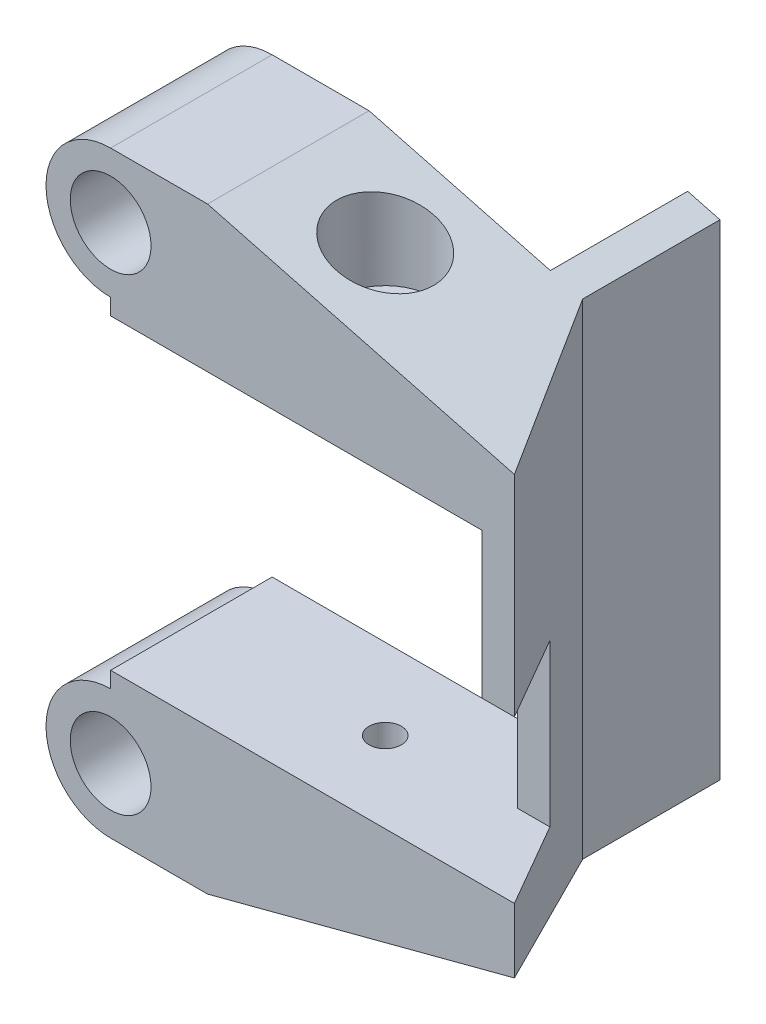
ISO-10303-21;
HEADER;
FILE_DESCRIPTION(('STEP AP214'),'2;1');
FILE_NAME('part.step','',(''),(''),'','','');
FILE_SCHEMA(('AUTOMOTIVE_DESIGN { 1 0 10303 214 1 1 1 1 }'));
ENDSEC;
DATA;
#1=APPLICATION_CONTEXT('core data for automotive mechanical design processes');
#2=APPLICATION_PROTOCOL_DEFINITION('international standard','automotive_design',2000,#1);
#3=PRODUCT_CONTEXT('',#1,'mechanical');
#4=PRODUCT('Part','Part','',(#3));
#5=PRODUCT_RELATED_PRODUCT_CATEGORY('part','',(#4));
#6=PRODUCT_DEFINITION_FORMATION('','',#4);
#7=PRODUCT_DEFINITION_CONTEXT('part definition',#1,'design');
#8=PRODUCT_DEFINITION('design','',#6,#7);
#9=PRODUCT_DEFINITION_SHAPE('','',#8);
#10=(LENGTH_UNIT() NAMED_UNIT(*) SI_UNIT(.MILLI.,.METRE.));
#11=(NAMED_UNIT(*) PLANE_ANGLE_UNIT() SI_UNIT($,.RADIAN.));
#12=(NAMED_UNIT(*) SI_UNIT($,.STERADIAN.) SOLID_ANGLE_UNIT());
#13=UNCERTAINTY_MEASURE_WITH_UNIT(LENGTH_MEASURE(1.E-05),#10,'distance_accuracy_value','');
#14=(GEOMETRIC_REPRESENTATION_CONTEXT(3) GLOBAL_UNCERTAINTY_ASSIGNED_CONTEXT((#13)) GLOBAL_UNIT_ASSIGNED_CONTEXT((#10,
#11,#12)) REPRESENTATION_CONTEXT('',''));
#15=CARTESIAN_POINT('',(0.,0.,0.));
#16=DIRECTION('',(0.,0.,1.));
#17=DIRECTION('',(1.,0.,0.));
#18=AXIS2_PLACEMENT_3D('',#15,#16,#17);
#19=CARTESIAN_POINT('',(-131.23163521819,17.7006515426684,10.));
#20=DIRECTION('',(0.,0.,1.));
#21=DIRECTION('',(1.,0.,0.));
#22=AXIS2_PLACEMENT_3D('',#19,#20,#21);
#23=PLANE('',#22);
#24=DIRECTION('',(-1.,0.,0.));
#25=VECTOR('',#24,1.);
#26=CARTESIAN_POINT('',(-108.23163521819,32.7006515426684,10.));
#27=LINE('',#26,#25);
#28=CARTESIAN_POINT('',(-106.23163521819,32.7006515426684,10.));
#29=VERTEX_POINT('',#28);
#30=CARTESIAN_POINT('',(-108.23163521819,32.7006515426684,10.));
#31=VERTEX_POINT('',#30);
#32=EDGE_CURVE('E181',#29,#31,#27,.T.);
#33=ORIENTED_EDGE('',*,*,#32,.F.);
#34=DIRECTION('',(0.,1.,0.));
#35=VECTOR('',#34,1.);
#36=CARTESIAN_POINT('',(-106.23163521819,22.7006515426684,10.));
#37=LINE('',#36,#35);
#38=CARTESIAN_POINT('',(-106.23163521819,45.7006515426684,10.));
#39=VERTEX_POINT('',#38);
#40=EDGE_CURVE('E219',#29,#39,#37,.T.);
#41=ORIENTED_EDGE('',*,*,#40,.T.);
#42=DIRECTION('',(-0.967074537262646,0.254493299279644,0.));
#43=VECTOR('',#42,1.);
#44=CARTESIAN_POINT('',(-125.23163521819,50.7006515426684,10.));
#45=LINE('',#44,#43);
#46=CARTESIAN_POINT('',(-125.23163521819,50.7006515426684,10.));
#47=VERTEX_POINT('',#46);
#48=EDGE_CURVE('E336',#39,#47,#45,.T.);
#49=ORIENTED_EDGE('',*,*,#48,.T.);
#50=DIRECTION('',(1.,0.,0.));
#51=VECTOR('',#50,1.);
#52=CARTESIAN_POINT('',(-125.23163521819,50.7006515426684,10.));
#53=LINE('',#52,#51);
#54=CARTESIAN_POINT('',(-131.23163521819,50.7006515426684,10.));
#55=VERTEX_POINT('',#54);
#56=EDGE_CURVE('E298',#55,#47,#53,.T.);
#57=ORIENTED_EDGE('',*,*,#56,.F.);
#58=CARTESIAN_POINT('',(-131.23163521819,46.7006515426684,10.));
#59=DIRECTION('',(0.,0.,-1.));
#60=DIRECTION('',(1.,0.,0.));
#61=AXIS2_PLACEMENT_3D('',#58,#59,#60);
#62=CIRCLE('',#61,4.);
#63=CARTESIAN_POINT('',(-131.23163521819,42.7006515426684,10.));
#64=VERTEX_POINT('',#63);
#65=EDGE_CURVE('E315',#64,#55,#62,.T.);
#66=ORIENTED_EDGE('',*,*,#65,.F.);
#67=DIRECTION('',(0.,1.,0.));
#68=VECTOR('',#67,1.);
#69=CARTESIAN_POINT('',(-131.23163521819,41.7006515426684,10.));
#70=LINE('',#69,#68);
#71=CARTESIAN_POINT('',(-131.23163521819,41.7006515426684,10.));
#72=VERTEX_POINT('',#71);
#73=EDGE_CURVE('E318',#72,#64,#70,.T.);
#74=ORIENTED_EDGE('',*,*,#73,.F.);
#75=DIRECTION('',(-1.,0.,0.));
#76=VECTOR('',#75,1.);
#77=CARTESIAN_POINT('',(-106.23163521819,41.7006515426684,10.));
#78=LINE('',#77,#76);
#79=CARTESIAN_POINT('',(-108.23163521819,41.7006515426684,10.));
#80=VERTEX_POINT('',#79);
#81=EDGE_CURVE('E302',#80,#72,#78,.T.);
#82=ORIENTED_EDGE('',*,*,#81,.F.);
#83=DIRECTION('',(0.,-1.,0.));
#84=VECTOR('',#83,1.);
#85=CARTESIAN_POINT('',(-108.23163521819,32.2006515426684,10.));
#86=LINE('',#85,#84);
#87=EDGE_CURVE('E194',#80,#31,#86,.T.);
#88=ORIENTED_EDGE('',*,*,#87,.T.);
#89=EDGE_LOOP('',(#33,#41,#49,#57,#66,#74,#82,#88));
#90=FACE_BOUND('',#89,.T.);
#91=CARTESIAN_POINT('',(-131.23163521819,46.7006515426684,10.));
#92=DIRECTION('',(0.,0.,-1.));
#93=DIRECTION('',(1.,0.,0.));
#94=AXIS2_PLACEMENT_3D('',#91,#92,#93);
#95=CIRCLE('',#94,2.5);
#96=CARTESIAN_POINT('',(-128.73163521819,46.7006515426684,10.));
#97=VERTEX_POINT('',#96);
#98=EDGE_CURVE('E312',#97,#97,#95,.T.);
#99=ORIENTED_EDGE('',*,*,#98,.T.);
#100=EDGE_LOOP('',(#99));
#101=FACE_BOUND('',#100,.T.);
#102=ADVANCED_FACE('F33',(#90,#101),#23,.T.);
#103=CARTESIAN_POINT('',(-131.23163521819,17.7006515426684,0.));
#104=DIRECTION('',(0.,0.,1.));
#105=DIRECTION('',(1.,0.,0.));
#106=AXIS2_PLACEMENT_3D('',#103,#104,#105);
#107=PLANE('',#106);
#108=CARTESIAN_POINT('',(-131.23163521819,17.7006515426684,0.));
#109=DIRECTION('',(0.,0.,1.));
#110=DIRECTION('',(1.,0.,0.));
#111=AXIS2_PLACEMENT_3D('',#108,#109,#110);
#112=CIRCLE('',#111,2.5);
#113=CARTESIAN_POINT('',(-128.73163521819,17.7006515426684,0.));
#114=VERTEX_POINT('',#113);
#115=EDGE_CURVE('E209',#114,#114,#112,.T.);
#116=ORIENTED_EDGE('',*,*,#115,.T.);
#117=EDGE_LOOP('',(#116));
#118=FACE_BOUND('',#117,.T.);
#119=DIRECTION('',(0.,1.,0.));
#120=VECTOR('',#119,1.);
#121=CARTESIAN_POINT('',(-114.005137910086,32.2006515426684,0.));
#122=LINE('',#121,#120);
#123=CARTESIAN_POINT('',(-114.005137910086,16.6549929395378,0.));
#124=VERTEX_POINT('',#123);
#125=CARTESIAN_POINT('',(-114.005137910086,22.7006515426684,0.));
#126=VERTEX_POINT('',#125);
#127=EDGE_CURVE('E201',#124,#126,#122,.T.);
#128=ORIENTED_EDGE('',*,*,#127,.F.);
#129=DIRECTION('',(-0.967074537262646,-0.254493299279644,0.));
#130=VECTOR('',#129,1.);
#131=CARTESIAN_POINT('',(-125.23163521819,13.7006515426684,0.));
#132=LINE('',#131,#130);
#133=CARTESIAN_POINT('',(-125.23163521819,13.7006515426684,0.));
#134=VERTEX_POINT('',#133);
#135=EDGE_CURVE('E263',#124,#134,#132,.T.);
#136=ORIENTED_EDGE('',*,*,#135,.T.);
#137=DIRECTION('',(1.,0.,0.));
#138=VECTOR('',#137,1.);
#139=CARTESIAN_POINT('',(-125.23163521819,13.7006515426684,0.));
#140=LINE('',#139,#138);
#141=CARTESIAN_POINT('',(-131.23163521819,13.7006515426684,0.));
#142=VERTEX_POINT('',#141);
#143=EDGE_CURVE('E216',#142,#134,#140,.T.);
#144=ORIENTED_EDGE('',*,*,#143,.F.);
#145=CARTESIAN_POINT('',(-131.23163521819,17.7006515426684,0.));
#146=DIRECTION('',(0.,0.,1.));
#147=DIRECTION('',(1.,0.,0.));
#148=AXIS2_PLACEMENT_3D('',#145,#146,#147);
#149=CIRCLE('',#148,4.);
#150=CARTESIAN_POINT('',(-131.23163521819,21.7006515426684,0.));
#151=VERTEX_POINT('',#150);
#152=EDGE_CURVE('E76',#151,#142,#149,.T.);
#153=ORIENTED_EDGE('',*,*,#152,.F.);
#154=DIRECTION('',(0.,-1.,0.));
#155=VECTOR('',#154,1.);
#156=CARTESIAN_POINT('',(-131.23163521819,22.7006515426684,0.));
#157=LINE('',#156,#155);
#158=CARTESIAN_POINT('',(-131.23163521819,22.7006515426684,0.));
#159=VERTEX_POINT('',#158);
#160=EDGE_CURVE('E203',#159,#151,#157,.T.);
#161=ORIENTED_EDGE('',*,*,#160,.F.);
#162=DIRECTION('',(-1.,0.,0.));
#163=VECTOR('',#162,1.);
#164=CARTESIAN_POINT('',(-106.23163521819,22.7006515426684,0.));
#165=LINE('',#164,#163);
#166=EDGE_CURVE('E199',#126,#159,#165,.T.);
#167=ORIENTED_EDGE('',*,*,#166,.F.);
#168=EDGE_LOOP('',(#128,#136,#144,#153,#161,#167));
#169=FACE_BOUND('',#168,.T.);
#170=ADVANCED_FACE('F200',(#118,#169),#107,.F.);
#171=CARTESIAN_POINT('',(-119.23163521819,22.7006515426684,5.));
#172=DIRECTION('',(0.,-1.,0.));
#173=DIRECTION('',(0.,0.,-1.));
#174=AXIS2_PLACEMENT_3D('',#171,#172,#173);
#175=CYLINDRICAL_SURFACE('',#174,0.999999999999998);
#176=CARTESIAN_POINT('',(-119.23163521819,22.7006515426684,5.));
#177=DIRECTION('',(0.,-1.,0.));
#178=DIRECTION('',(0.,0.,-1.));
#179=AXIS2_PLACEMENT_3D('',#176,#177,#178);
#180=CIRCLE('',#179,0.999999999999998);
#181=CARTESIAN_POINT('',(-119.23163521819,22.7006515426684,4.));
#182=VERTEX_POINT('',#181);
#183=EDGE_CURVE('E240',#182,#182,#180,.T.);
#184=ORIENTED_EDGE('',*,*,#183,.F.);
#185=EDGE_LOOP('',(#184));
#186=FACE_BOUND('',#185,.T.);
#187=CARTESIAN_POINT('',(-119.23163521819,19.7006515426684,5.));
#188=DIRECTION('',(0.,-1.,0.));
#189=DIRECTION('',(0.,0.,-1.));
#190=AXIS2_PLACEMENT_3D('',#187,#188,#189);
#191=CIRCLE('',#190,0.999999999999998);
#192=CARTESIAN_POINT('',(-119.23163521819,19.7006515426684,4.));
#193=VERTEX_POINT('',#192);
#194=EDGE_CURVE('E224',#193,#193,#191,.F.);
#195=ORIENTED_EDGE('',*,*,#194,.F.);
#196=EDGE_LOOP('',(#195));
#197=FACE_BOUND('',#196,.T.);
#198=ADVANCED_FACE('F415',(#186,#197),#175,.F.);
#199=CARTESIAN_POINT('',(-106.23163521819,18.7006515426684,10.));
#200=VERTEX_POINT('',#199);
#201=CARTESIAN_POINT('',(-106.23163521819,22.7006515426684,10.));
#202=VERTEX_POINT('',#201);
#203=EDGE_CURVE('E246',#200,#202,#37,.T.);
#204=ORIENTED_EDGE('',*,*,#203,.T.);
#205=DIRECTION('',(-1.,0.,0.));
#206=VECTOR('',#205,1.);
#207=CARTESIAN_POINT('',(-106.23163521819,22.7006515426684,10.));
#208=LINE('',#207,#206);
#209=CARTESIAN_POINT('',(-131.23163521819,22.7006515426684,10.));
#210=VERTEX_POINT('',#209);
#211=EDGE_CURVE('E81',#202,#210,#208,.T.);
#212=ORIENTED_EDGE('',*,*,#211,.T.);
#213=DIRECTION('',(0.,-1.,0.));
#214=VECTOR('',#213,1.);
#215=CARTESIAN_POINT('',(-131.23163521819,22.7006515426684,10.));
#216=LINE('',#215,#214);
#217=CARTESIAN_POINT('',(-131.23163521819,21.7006515426684,10.));
#218=VERTEX_POINT('',#217);
#219=EDGE_CURVE('E249',#210,#218,#216,.T.);
#220=ORIENTED_EDGE('',*,*,#219,.T.);
#221=CARTESIAN_POINT('',(-131.23163521819,17.7006515426684,10.));
#222=DIRECTION('',(0.,0.,1.));
#223=DIRECTION('',(1.,0.,0.));
#224=AXIS2_PLACEMENT_3D('',#221,#222,#223);
#225=CIRCLE('',#224,4.);
#226=CARTESIAN_POINT('',(-131.23163521819,13.7006515426684,10.));
#227=VERTEX_POINT('',#226);
#228=EDGE_CURVE('E59',#218,#227,#225,.T.);
#229=ORIENTED_EDGE('',*,*,#228,.T.);
#230=DIRECTION('',(1.,0.,0.));
#231=VECTOR('',#230,1.);
#232=CARTESIAN_POINT('',(-125.23163521819,13.7006515426684,10.));
#233=LINE('',#232,#231);
#234=CARTESIAN_POINT('',(-125.23163521819,13.7006515426684,10.));
#235=VERTEX_POINT('',#234);
#236=EDGE_CURVE('E212',#227,#235,#233,.T.);
#237=ORIENTED_EDGE('',*,*,#236,.T.);
#238=DIRECTION('',(-0.967074537262646,-0.254493299279644,0.));
#239=VECTOR('',#238,1.);
#240=CARTESIAN_POINT('',(-125.23163521819,13.7006515426684,10.));
#241=LINE('',#240,#239);
#242=EDGE_CURVE('E254',#200,#235,#241,.T.);
#243=ORIENTED_EDGE('',*,*,#242,.F.);
#244=EDGE_LOOP('',(#204,#212,#220,#229,#237,#243));
#245=FACE_BOUND('',#244,.T.);
#246=CARTESIAN_POINT('',(-131.23163521819,17.7006515426684,10.));
#247=DIRECTION('',(0.,0.,1.));
#248=DIRECTION('',(1.,0.,0.));
#249=AXIS2_PLACEMENT_3D('',#246,#247,#248);
#250=CIRCLE('',#249,2.5);
#251=CARTESIAN_POINT('',(-128.73163521819,17.7006515426684,10.));
#252=VERTEX_POINT('',#251);
#253=EDGE_CURVE('E205',#252,#252,#250,.T.);
#254=ORIENTED_EDGE('',*,*,#253,.F.);
#255=EDGE_LOOP('',(#254));
#256=FACE_BOUND('',#255,.T.);
#257=ADVANCED_FACE('F252',(#245,#256),#23,.T.);
#258=CARTESIAN_POINT('',(-106.23163521819,22.7006515426684,10.));
#259=DIRECTION('',(0.,-1.,0.));
#260=DIRECTION('',(0.,0.,-1.));
#261=AXIS2_PLACEMENT_3D('',#258,#259,#260);
#262=PLANE('',#261);
#263=ORIENTED_EDGE('',*,*,#183,.T.);
#264=EDGE_LOOP('',(#263));
#265=FACE_BOUND('',#264,.T.);
#266=ORIENTED_EDGE('',*,*,#211,.F.);
#267=DIRECTION('',(0.499999999999995,0.,0.866025403784441));
#268=VECTOR('',#267,1.);
#269=CARTESIAN_POINT('',(-109.23163521819,22.7006515426684,4.80384757729335));
#270=LINE('',#269,#268);
#271=CARTESIAN_POINT('',(-109.23163521819,22.7006515426684,4.80384757729335));
#272=VERTEX_POINT('',#271);
#273=EDGE_CURVE('E172',#272,#202,#270,.T.);
#274=ORIENTED_EDGE('',*,*,#273,.F.);
#275=DIRECTION('',(1.,0.,0.));
#276=VECTOR('',#275,1.);
#277=CARTESIAN_POINT('',(-111.23163521819,22.7006515426684,4.80384757729335));
#278=LINE('',#277,#276);
#279=CARTESIAN_POINT('',(-111.23163521819,22.7006515426684,4.80384757729335));
#280=VERTEX_POINT('',#279);
#281=EDGE_CURVE('E168',#280,#272,#278,.T.);
#282=ORIENTED_EDGE('',*,*,#281,.F.);
#283=DIRECTION('',(-0.499999999999995,0.,-0.866025403784442));
#284=VECTOR('',#283,1.);
#285=CARTESIAN_POINT('',(-107.73163521819,22.7006515426684,10.8660254037844));
#286=LINE('',#285,#284);
#287=EDGE_CURVE('E11',#280,#126,#286,.T.);
#288=ORIENTED_EDGE('',*,*,#287,.T.);
#289=ORIENTED_EDGE('',*,*,#166,.T.);
#290=DIRECTION('',(0.,0.,-1.));
#291=VECTOR('',#290,1.);
#292=CARTESIAN_POINT('',(-131.23163521819,22.7006515426684,10.));
#293=LINE('',#292,#291);
#294=EDGE_CURVE('E42',#210,#159,#293,.T.);
#295=ORIENTED_EDGE('',*,*,#294,.F.);
#296=EDGE_LOOP('',(#266,#274,#282,#288,#289,#295));
#297=FACE_BOUND('',#296,.T.);
#298=ADVANCED_FACE('F35',(#265,#297),#262,.F.);
#299=CARTESIAN_POINT('',(-131.23163521819,22.7006515426684,10.));
#300=DIRECTION('',(1.,0.,0.));
#301=DIRECTION('',(0.,1.,0.));
#302=AXIS2_PLACEMENT_3D('',#299,#300,#301);
#303=PLANE('',#302);
#304=ORIENTED_EDGE('',*,*,#160,.T.);
#305=DIRECTION('',(0.,0.,-1.));
#306=VECTOR('',#305,1.);
#307=CARTESIAN_POINT('',(-131.23163521819,21.7006515426684,10.));
#308=LINE('',#307,#306);
#309=EDGE_CURVE('E222',#218,#151,#308,.T.);
#310=ORIENTED_EDGE('',*,*,#309,.F.);
#311=ORIENTED_EDGE('',*,*,#219,.F.);
#312=ORIENTED_EDGE('',*,*,#294,.T.);
#313=EDGE_LOOP('',(#304,#310,#311,#312));
#314=FACE_BOUND('',#313,.T.);
#315=ADVANCED_FACE('F424',(#314),#303,.F.);
#316=CARTESIAN_POINT('',(-131.23163521819,17.7006515426684,10.));
#317=DIRECTION('',(0.,0.,-1.));
#318=DIRECTION('',(-1.,0.,0.));
#319=AXIS2_PLACEMENT_3D('',#316,#317,#318);
#320=CYLINDRICAL_SURFACE('',#319,4.);
#321=ORIENTED_EDGE('',*,*,#152,.T.);
#322=DIRECTION('',(0.,0.,-1.));
#323=VECTOR('',#322,1.);
#324=CARTESIAN_POINT('',(-131.23163521819,13.7006515426684,10.));
#325=LINE('',#324,#323);
#326=EDGE_CURVE('E220',#227,#142,#325,.T.);
#327=ORIENTED_EDGE('',*,*,#326,.F.);
#328=ORIENTED_EDGE('',*,*,#228,.F.);
#329=ORIENTED_EDGE('',*,*,#309,.T.);
#330=EDGE_LOOP('',(#321,#327,#328,#329));
#331=FACE_BOUND('',#330,.T.);
#332=ADVANCED_FACE('F441',(#331),#320,.T.);
#333=CARTESIAN_POINT('',(-125.23163521819,13.7006515426684,10.));
#334=DIRECTION('',(0.,1.,0.));
#335=DIRECTION('',(0.,0.,1.));
#336=AXIS2_PLACEMENT_3D('',#333,#334,#335);
#337=PLANE('',#336);
#338=ORIENTED_EDGE('',*,*,#143,.T.);
#339=DIRECTION('',(0.,0.,1.));
#340=VECTOR('',#339,1.);
#341=CARTESIAN_POINT('',(-125.23163521819,13.7006515426684,0.));
#342=LINE('',#341,#340);
#343=EDGE_CURVE('E261',#134,#235,#342,.T.);
#344=ORIENTED_EDGE('',*,*,#343,.T.);
#345=ORIENTED_EDGE('',*,*,#236,.F.);
#346=ORIENTED_EDGE('',*,*,#326,.T.);
#347=EDGE_LOOP('',(#338,#344,#345,#346));
#348=FACE_BOUND('',#347,.T.);
#349=ADVANCED_FACE('F258',(#348),#337,.F.);
#350=CARTESIAN_POINT('',(-131.23163521819,17.7006515426684,10.));
#351=DIRECTION('',(0.,0.,-1.));
#352=DIRECTION('',(-1.,0.,0.));
#353=AXIS2_PLACEMENT_3D('',#350,#351,#352);
#354=CYLINDRICAL_SURFACE('',#353,2.5);
#355=ORIENTED_EDGE('',*,*,#253,.T.);
#356=EDGE_LOOP('',(#355));
#357=FACE_BOUND('',#356,.T.);
#358=ORIENTED_EDGE('',*,*,#115,.F.);
#359=EDGE_LOOP('',(#358));
#360=FACE_BOUND('',#359,.T.);
#361=ADVANCED_FACE('F435',(#357,#360),#354,.F.);
#362=CARTESIAN_POINT('',(-106.23163521819,22.7006515426684,9.99999999999999));
#363=DIRECTION('',(-0.866025403784442,0.,0.499999999999995));
#364=DIRECTION('',(0.499999999999995,0.,0.866025403784442));
#365=AXIS2_PLACEMENT_3D('',#362,#363,#364);
#366=PLANE('',#365);
#367=ORIENTED_EDGE('',*,*,#40,.F.);
#368=DIRECTION('',(0.499999999999995,0.,0.866025403784441));
#369=VECTOR('',#368,1.);
#370=CARTESIAN_POINT('',(-109.23163521819,32.7006515426684,4.80384757729335));
#371=LINE('',#370,#369);
#372=CARTESIAN_POINT('',(-109.23163521819,32.7006515426684,4.80384757729335));
#373=VERTEX_POINT('',#372);
#374=EDGE_CURVE('E354',#373,#29,#371,.T.);
#375=ORIENTED_EDGE('',*,*,#374,.F.);
#376=DIRECTION('',(0.,1.,0.));
#377=VECTOR('',#376,1.);
#378=CARTESIAN_POINT('',(-109.23163521819,22.7006515426684,4.80384757729335));
#379=LINE('',#378,#377);
#380=EDGE_CURVE('E174',#272,#373,#379,.T.);
#381=ORIENTED_EDGE('',*,*,#380,.F.);
#382=ORIENTED_EDGE('',*,*,#273,.T.);
#383=ORIENTED_EDGE('',*,*,#203,.F.);
#384=DIRECTION('',(-0.495727147771267,-0.130454512571386,-0.858624606631051));
#385=VECTOR('',#384,1.);
#386=CARTESIAN_POINT('',(-105.972955844466,18.7687250620693,10.4480458181594));
#387=LINE('',#386,#385);
#388=CARTESIAN_POINT('',(-112.005137910086,17.1813087290115,0.));
#389=VERTEX_POINT('',#388);
#390=EDGE_CURVE('E232',#200,#389,#387,.T.);
#391=ORIENTED_EDGE('',*,*,#390,.T.);
#392=DIRECTION('',(0.,-1.,0.));
#393=VECTOR('',#392,1.);
#394=CARTESIAN_POINT('',(-112.005137910086,22.7006515426684,0.));
#395=LINE('',#394,#393);
#396=CARTESIAN_POINT('',(-112.005137910086,47.2199943563253,0.));
#397=VERTEX_POINT('',#396);
#398=EDGE_CURVE('E193',#397,#389,#395,.T.);
#399=ORIENTED_EDGE('',*,*,#398,.F.);
#400=DIRECTION('',(-0.495727147771267,0.130454512571386,-0.858624606631051));
#401=VECTOR('',#400,1.);
#402=CARTESIAN_POINT('',(-105.972955844466,45.6325780232674,10.4480458181594));
#403=LINE('',#402,#401);
#404=EDGE_CURVE('E284',#39,#397,#403,.T.);
#405=ORIENTED_EDGE('',*,*,#404,.F.);
#406=EDGE_LOOP('',(#367,#375,#381,#382,#383,#391,#399,#405));
#407=FACE_BOUND('',#406,.T.);
#408=ADVANCED_FACE('F365',(#407),#366,.F.);
#409=CARTESIAN_POINT('',(-108.23163521819,32.2006515426684,10.));
#410=DIRECTION('',(-0.866025403784442,0.,0.499999999999995));
#411=DIRECTION('',(0.499999999999995,0.,0.866025403784442));
#412=AXIS2_PLACEMENT_3D('',#409,#410,#411);
#413=PLANE('',#412);
#414=DIRECTION('',(0.499999999999995,0.,0.866025403784441));
#415=VECTOR('',#414,1.);
#416=CARTESIAN_POINT('',(-111.23163521819,32.7006515426684,4.80384757729335));
#417=LINE('',#416,#415);
#418=CARTESIAN_POINT('',(-111.23163521819,32.7006515426684,4.80384757729335));
#419=VERTEX_POINT('',#418);
#420=EDGE_CURVE('E350',#419,#31,#417,.T.);
#421=ORIENTED_EDGE('',*,*,#420,.T.);
#422=ORIENTED_EDGE('',*,*,#87,.F.);
#423=DIRECTION('',(-0.499999999999995,0.,-0.866025403784442));
#424=VECTOR('',#423,1.);
#425=CARTESIAN_POINT('',(-107.73163521819,41.7006515426684,10.8660254037844));
#426=LINE('',#425,#424);
#427=CARTESIAN_POINT('',(-114.005137910086,41.7006515426684,0.));
#428=VERTEX_POINT('',#427);
#429=EDGE_CURVE('E189',#80,#428,#426,.T.);
#430=ORIENTED_EDGE('',*,*,#429,.T.);
#431=DIRECTION('',(0.,-1.,0.));
#432=VECTOR('',#431,1.);
#433=CARTESIAN_POINT('',(-114.005137910086,32.2006515426684,0.));
#434=LINE('',#433,#432);
#435=EDGE_CURVE('E186',#428,#126,#434,.T.);
#436=ORIENTED_EDGE('',*,*,#435,.T.);
#437=ORIENTED_EDGE('',*,*,#287,.F.);
#438=DIRECTION('',(0.,-1.,0.));
#439=VECTOR('',#438,1.);
#440=CARTESIAN_POINT('',(-111.23163521819,22.7006515426684,4.80384757729335));
#441=LINE('',#440,#439);
#442=EDGE_CURVE('E175',#419,#280,#441,.T.);
#443=ORIENTED_EDGE('',*,*,#442,.F.);
#444=EDGE_LOOP('',(#421,#422,#430,#436,#437,#443));
#445=FACE_BOUND('',#444,.T.);
#446=ADVANCED_FACE('F184',(#445),#413,.T.);
#447=CARTESIAN_POINT('',(-119.23163521819,19.7006515426684,5.));
#448=DIRECTION('',(0.,-1.,0.));
#449=DIRECTION('',(0.,0.,-1.));
#450=AXIS2_PLACEMENT_3D('',#447,#448,#449);
#451=PLANE('',#450);
#452=CARTESIAN_POINT('',(-119.23163521819,19.7006515426684,5.));
#453=DIRECTION('',(0.,-1.,0.));
#454=DIRECTION('',(0.,0.,-1.));
#455=AXIS2_PLACEMENT_3D('',#452,#453,#454);
#456=CIRCLE('',#455,3.00000000000001);
#457=CARTESIAN_POINT('',(-119.23163521819,19.7006515426684,1.99999999999999));
#458=VERTEX_POINT('',#457);
#459=EDGE_CURVE('E226',#458,#458,#456,.T.);
#460=ORIENTED_EDGE('',*,*,#459,.T.);
#461=EDGE_LOOP('',(#460));
#462=FACE_BOUND('',#461,.T.);
#463=ORIENTED_EDGE('',*,*,#194,.T.);
#464=EDGE_LOOP('',(#463));
#465=FACE_BOUND('',#464,.T.);
#466=ADVANCED_FACE('F405',(#462,#465),#451,.T.);
#467=CARTESIAN_POINT('',(-119.23163521819,19.7006515426684,5.));
#468=DIRECTION('',(0.,-1.,0.));
#469=DIRECTION('',(0.,0.,-1.));
#470=AXIS2_PLACEMENT_3D('',#467,#468,#469);
#471=CYLINDRICAL_SURFACE('',#470,3.00000000000001);
#472=CARTESIAN_POINT('',(-119.23163521819,15.2795989110894,5.));
#473=DIRECTION('',(-0.254493299279644,0.967074537262646,0.));
#474=DIRECTION('',(-0.967074537262647,-0.254493299279644,0.));
#475=AXIS2_PLACEMENT_3D('',#472,#473,#474);
#476=ELLIPSE('',#475,3.10213937437714,3.00000000000001);
#477=CARTESIAN_POINT('',(-122.23163521819,14.4901252268789,5.));
#478=VERTEX_POINT('',#477);
#479=EDGE_CURVE('E37',#478,#478,#476,.F.);
#480=ORIENTED_EDGE('',*,*,#479,.T.);
#481=EDGE_LOOP('',(#480));
#482=FACE_BOUND('',#481,.T.);
#483=ORIENTED_EDGE('',*,*,#459,.F.);
#484=EDGE_LOOP('',(#483));
#485=FACE_BOUND('',#484,.T.);
#486=ADVANCED_FACE('F396',(#482,#485),#471,.F.);
#487=CARTESIAN_POINT('',(-125.23163521819,13.7006515426684,0.));
#488=DIRECTION('',(-0.254493299279644,0.967074537262646,0.));
#489=DIRECTION('',(-0.967074537262647,-0.254493299279644,0.));
#490=AXIS2_PLACEMENT_3D('',#487,#488,#489);
#491=PLANE('',#490);
#492=ORIENTED_EDGE('',*,*,#479,.F.);
#493=EDGE_LOOP('',(#492));
#494=FACE_BOUND('',#493,.T.);
#495=ORIENTED_EDGE('',*,*,#242,.T.);
#496=ORIENTED_EDGE('',*,*,#343,.F.);
#497=ORIENTED_EDGE('',*,*,#135,.F.);
#498=DIRECTION('',(0.,0.,1.));
#499=VECTOR('',#498,1.);
#500=CARTESIAN_POINT('',(-114.005137910086,16.6549929395378,-8.5));
#501=LINE('',#500,#499);
#502=CARTESIAN_POINT('',(-114.005137910086,16.6549929395378,-8.5));
#503=VERTEX_POINT('',#502);
#504=EDGE_CURVE('E267',#503,#124,#501,.T.);
#505=ORIENTED_EDGE('',*,*,#504,.F.);
#506=DIRECTION('',(-0.967074537262646,-0.254493299279643,0.));
#507=VECTOR('',#506,1.);
#508=CARTESIAN_POINT('',(-114.005137910086,16.6549929395378,-8.5));
#509=LINE('',#508,#507);
#510=CARTESIAN_POINT('',(-112.005137910086,17.1813087290115,-8.5));
#511=VERTEX_POINT('',#510);
#512=EDGE_CURVE('E275',#511,#503,#509,.T.);
#513=ORIENTED_EDGE('',*,*,#512,.F.);
#514=DIRECTION('',(0.,0.,1.));
#515=VECTOR('',#514,1.);
#516=CARTESIAN_POINT('',(-112.005137910086,17.1813087290115,-8.5));
#517=LINE('',#516,#515);
#518=EDGE_CURVE('E270',#511,#389,#517,.T.);
#519=ORIENTED_EDGE('',*,*,#518,.T.);
#520=ORIENTED_EDGE('',*,*,#390,.F.);
#521=EDGE_LOOP('',(#495,#496,#497,#505,#513,#519,#520));
#522=FACE_BOUND('',#521,.T.);
#523=ADVANCED_FACE('F394',(#494,#522),#491,.F.);
#524=CARTESIAN_POINT('',(-114.005137910086,32.2006515426684,-8.5));
#525=DIRECTION('',(1.,0.,0.));
#526=DIRECTION('',(0.,0.,-1.));
#527=AXIS2_PLACEMENT_3D('',#524,#525,#526);
#528=PLANE('',#527);
#529=ORIENTED_EDGE('',*,*,#127,.T.);
#530=ORIENTED_EDGE('',*,*,#435,.F.);
#531=DIRECTION('',(0.,-1.,0.));
#532=VECTOR('',#531,1.);
#533=CARTESIAN_POINT('',(-114.005137910086,32.2006515426684,0.));
#534=LINE('',#533,#532);
#535=CARTESIAN_POINT('',(-114.005137910086,47.7463101457989,0.));
#536=VERTEX_POINT('',#535);
#537=EDGE_CURVE('E347',#536,#428,#534,.T.);
#538=ORIENTED_EDGE('',*,*,#537,.F.);
#539=DIRECTION('',(0.,0.,1.));
#540=VECTOR('',#539,1.);
#541=CARTESIAN_POINT('',(-114.005137910086,47.7463101457989,-8.5));
#542=LINE('',#541,#540);
#543=CARTESIAN_POINT('',(-114.005137910086,47.7463101457989,-8.5));
#544=VERTEX_POINT('',#543);
#545=EDGE_CURVE('E339',#544,#536,#542,.T.);
#546=ORIENTED_EDGE('',*,*,#545,.F.);
#547=DIRECTION('',(0.,1.,0.));
#548=VECTOR('',#547,1.);
#549=CARTESIAN_POINT('',(-114.005137910086,32.2006515426684,-8.5));
#550=LINE('',#549,#548);
#551=EDGE_CURVE('E277',#503,#544,#550,.T.);
#552=ORIENTED_EDGE('',*,*,#551,.F.);
#553=ORIENTED_EDGE('',*,*,#504,.T.);
#554=EDGE_LOOP('',(#529,#530,#538,#546,#552,#553));
#555=FACE_BOUND('',#554,.T.);
#556=ADVANCED_FACE('F384',(#555),#528,.F.);
#557=CARTESIAN_POINT('',(-112.005137910086,17.1813087290115,-8.5));
#558=DIRECTION('',(-1.,0.,0.));
#559=DIRECTION('',(0.,0.,1.));
#560=AXIS2_PLACEMENT_3D('',#557,#558,#559);
#561=PLANE('',#560);
#562=ORIENTED_EDGE('',*,*,#398,.T.);
#563=ORIENTED_EDGE('',*,*,#518,.F.);
#564=DIRECTION('',(0.,-1.,0.));
#565=VECTOR('',#564,1.);
#566=CARTESIAN_POINT('',(-112.005137910086,17.1813087290115,-8.5));
#567=LINE('',#566,#565);
#568=CARTESIAN_POINT('',(-112.005137910086,47.2199943563253,-8.5));
#569=VERTEX_POINT('',#568);
#570=EDGE_CURVE('E273',#569,#511,#567,.T.);
#571=ORIENTED_EDGE('',*,*,#570,.F.);
#572=DIRECTION('',(0.,0.,1.));
#573=VECTOR('',#572,1.);
#574=CARTESIAN_POINT('',(-112.005137910086,47.2199943563253,-8.5));
#575=LINE('',#574,#573);
#576=EDGE_CURVE('E343',#569,#397,#575,.T.);
#577=ORIENTED_EDGE('',*,*,#576,.T.);
#578=EDGE_LOOP('',(#562,#563,#571,#577));
#579=FACE_BOUND('',#578,.T.);
#580=ADVANCED_FACE('F403',(#579),#561,.F.);
#581=CARTESIAN_POINT('',(0.,0.,-8.5));
#582=DIRECTION('',(0.,0.,1.));
#583=DIRECTION('',(1.,0.,0.));
#584=AXIS2_PLACEMENT_3D('',#581,#582,#583);
#585=PLANE('',#584);
#586=ORIENTED_EDGE('',*,*,#512,.T.);
#587=ORIENTED_EDGE('',*,*,#551,.T.);
#588=DIRECTION('',(-0.967074537262646,0.254493299279643,0.));
#589=VECTOR('',#588,1.);
#590=CARTESIAN_POINT('',(-114.005137910086,47.7463101457989,-8.5));
#591=LINE('',#590,#589);
#592=EDGE_CURVE('E346',#569,#544,#591,.T.);
#593=ORIENTED_EDGE('',*,*,#592,.F.);
#594=ORIENTED_EDGE('',*,*,#570,.T.);
#595=EDGE_LOOP('',(#586,#587,#593,#594));
#596=FACE_BOUND('',#595,.T.);
#597=ADVANCED_FACE('F390',(#596),#585,.F.);
#598=CARTESIAN_POINT('',(-131.23163521819,46.7006515426684,0.));
#599=DIRECTION('',(0.,0.,1.));
#600=DIRECTION('',(1.,0.,0.));
#601=AXIS2_PLACEMENT_3D('',#598,#599,#600);
#602=PLANE('',#601);
#603=CARTESIAN_POINT('',(-131.23163521819,46.7006515426684,0.));
#604=DIRECTION('',(0.,0.,-1.));
#605=DIRECTION('',(1.,0.,0.));
#606=AXIS2_PLACEMENT_3D('',#603,#604,#605);
#607=CIRCLE('',#606,2.5);
#608=CARTESIAN_POINT('',(-128.73163521819,46.7006515426684,0.));
#609=VERTEX_POINT('',#608);
#610=EDGE_CURVE('E323',#609,#609,#607,.T.);
#611=ORIENTED_EDGE('',*,*,#610,.F.);
#612=EDGE_LOOP('',(#611));
#613=FACE_BOUND('',#612,.T.);
#614=ORIENTED_EDGE('',*,*,#537,.T.);
#615=DIRECTION('',(-1.,0.,0.));
#616=VECTOR('',#615,1.);
#617=CARTESIAN_POINT('',(-106.23163521819,41.7006515426684,0.));
#618=LINE('',#617,#616);
#619=CARTESIAN_POINT('',(-131.23163521819,41.7006515426684,0.));
#620=VERTEX_POINT('',#619);
#621=EDGE_CURVE('E309',#428,#620,#618,.T.);
#622=ORIENTED_EDGE('',*,*,#621,.T.);
#623=DIRECTION('',(0.,1.,0.));
#624=VECTOR('',#623,1.);
#625=CARTESIAN_POINT('',(-131.23163521819,41.7006515426684,0.));
#626=LINE('',#625,#624);
#627=CARTESIAN_POINT('',(-131.23163521819,42.7006515426684,0.));
#628=VERTEX_POINT('',#627);
#629=EDGE_CURVE('E306',#620,#628,#626,.T.);
#630=ORIENTED_EDGE('',*,*,#629,.T.);
#631=CARTESIAN_POINT('',(-131.23163521819,46.7006515426684,0.));
#632=DIRECTION('',(0.,0.,-1.));
#633=DIRECTION('',(1.,0.,0.));
#634=AXIS2_PLACEMENT_3D('',#631,#632,#633);
#635=CIRCLE('',#634,4.);
#636=CARTESIAN_POINT('',(-131.23163521819,50.7006515426684,0.));
#637=VERTEX_POINT('',#636);
#638=EDGE_CURVE('E303',#628,#637,#635,.T.);
#639=ORIENTED_EDGE('',*,*,#638,.T.);
#640=DIRECTION('',(1.,0.,0.));
#641=VECTOR('',#640,1.);
#642=CARTESIAN_POINT('',(-125.23163521819,50.7006515426684,0.));
#643=LINE('',#642,#641);
#644=CARTESIAN_POINT('',(-125.23163521819,50.7006515426684,0.));
#645=VERTEX_POINT('',#644);
#646=EDGE_CURVE('E299',#637,#645,#643,.T.);
#647=ORIENTED_EDGE('',*,*,#646,.T.);
#648=DIRECTION('',(-0.967074537262646,0.254493299279644,0.));
#649=VECTOR('',#648,1.);
#650=CARTESIAN_POINT('',(-125.23163521819,50.7006515426684,0.));
#651=LINE('',#650,#649);
#652=EDGE_CURVE('E335',#536,#645,#651,.T.);
#653=ORIENTED_EDGE('',*,*,#652,.F.);
#654=EDGE_LOOP('',(#614,#622,#630,#639,#647,#653));
#655=FACE_BOUND('',#654,.T.);
#656=ADVANCED_FACE('F381',(#613,#655),#602,.F.);
#657=CARTESIAN_POINT('',(-119.23163521819,41.7006515426684,5.));
#658=DIRECTION('',(0.,1.,0.));
#659=DIRECTION('',(0.,0.,-1.));
#660=AXIS2_PLACEMENT_3D('',#657,#658,#659);
#661=CYLINDRICAL_SURFACE('',#660,0.999999999999998);
#662=CARTESIAN_POINT('',(-119.23163521819,41.7006515426684,5.));
#663=DIRECTION('',(0.,-1.,0.));
#664=DIRECTION('',(0.,0.,-1.));
#665=AXIS2_PLACEMENT_3D('',#662,#663,#664);
#666=CIRCLE('',#665,0.999999999999998);
#667=CARTESIAN_POINT('',(-119.23163521819,41.7006515426684,4.));
#668=VERTEX_POINT('',#667);
#669=EDGE_CURVE('E289',#668,#668,#666,.T.);
#670=ORIENTED_EDGE('',*,*,#669,.T.);
#671=EDGE_LOOP('',(#670));
#672=FACE_BOUND('',#671,.T.);
#673=CARTESIAN_POINT('',(-119.23163521819,44.7006515426684,5.));
#674=DIRECTION('',(0.,-1.,0.));
#675=DIRECTION('',(0.,0.,-1.));
#676=AXIS2_PLACEMENT_3D('',#673,#674,#675);
#677=CIRCLE('',#676,0.999999999999998);
#678=CARTESIAN_POINT('',(-119.23163521819,44.7006515426684,4.));
#679=VERTEX_POINT('',#678);
#680=EDGE_CURVE('E286',#679,#679,#677,.F.);
#681=ORIENTED_EDGE('',*,*,#680,.T.);
#682=EDGE_LOOP('',(#681));
#683=FACE_BOUND('',#682,.T.);
#684=ADVANCED_FACE('F475',(#672,#683),#661,.F.);
#685=CARTESIAN_POINT('',(-106.23163521819,41.7006515426684,10.));
#686=DIRECTION('',(0.,1.,0.));
#687=DIRECTION('',(0.,0.,-1.));
#688=AXIS2_PLACEMENT_3D('',#685,#686,#687);
#689=PLANE('',#688);
#690=ORIENTED_EDGE('',*,*,#669,.F.);
#691=EDGE_LOOP('',(#690));
#692=FACE_BOUND('',#691,.T.);
#693=ORIENTED_EDGE('',*,*,#81,.T.);
#694=DIRECTION('',(0.,0.,-1.));
#695=VECTOR('',#694,1.);
#696=CARTESIAN_POINT('',(-131.23163521819,41.7006515426684,10.));
#697=LINE('',#696,#695);
#698=EDGE_CURVE('E292',#72,#620,#697,.T.);
#699=ORIENTED_EDGE('',*,*,#698,.T.);
#700=ORIENTED_EDGE('',*,*,#621,.F.);
#701=ORIENTED_EDGE('',*,*,#429,.F.);
#702=EDGE_LOOP('',(#693,#699,#700,#701));
#703=FACE_BOUND('',#702,.T.);
#704=ADVANCED_FACE('F373',(#692,#703),#689,.F.);
#705=CARTESIAN_POINT('',(-131.23163521819,41.7006515426684,10.));
#706=DIRECTION('',(1.,0.,0.));
#707=DIRECTION('',(0.,-1.,0.));
#708=AXIS2_PLACEMENT_3D('',#705,#706,#707);
#709=PLANE('',#708);
#710=ORIENTED_EDGE('',*,*,#629,.F.);
#711=ORIENTED_EDGE('',*,*,#698,.F.);
#712=ORIENTED_EDGE('',*,*,#73,.T.);
#713=DIRECTION('',(0.,0.,-1.));
#714=VECTOR('',#713,1.);
#715=CARTESIAN_POINT('',(-131.23163521819,42.7006515426684,10.));
#716=LINE('',#715,#714);
#717=EDGE_CURVE('E294',#64,#628,#716,.T.);
#718=ORIENTED_EDGE('',*,*,#717,.T.);
#719=EDGE_LOOP('',(#710,#711,#712,#718));
#720=FACE_BOUND('',#719,.T.);
#721=ADVANCED_FACE('F378',(#720),#709,.F.);
#722=CARTESIAN_POINT('',(-131.23163521819,46.7006515426684,10.));
#723=DIRECTION('',(0.,0.,-1.));
#724=DIRECTION('',(-1.,0.,0.));
#725=AXIS2_PLACEMENT_3D('',#722,#723,#724);
#726=CYLINDRICAL_SURFACE('',#725,4.);
#727=ORIENTED_EDGE('',*,*,#638,.F.);
#728=ORIENTED_EDGE('',*,*,#717,.F.);
#729=ORIENTED_EDGE('',*,*,#65,.T.);
#730=DIRECTION('',(0.,0.,-1.));
#731=VECTOR('',#730,1.);
#732=CARTESIAN_POINT('',(-131.23163521819,50.7006515426684,10.));
#733=LINE('',#732,#731);
#734=EDGE_CURVE('E296',#55,#637,#733,.T.);
#735=ORIENTED_EDGE('',*,*,#734,.T.);
#736=EDGE_LOOP('',(#727,#728,#729,#735));
#737=FACE_BOUND('',#736,.T.);
#738=ADVANCED_FACE('F461',(#737),#726,.T.);
#739=CARTESIAN_POINT('',(-125.23163521819,50.7006515426684,10.));
#740=DIRECTION('',(0.,-1.,0.));
#741=DIRECTION('',(0.,0.,1.));
#742=AXIS2_PLACEMENT_3D('',#739,#740,#741);
#743=PLANE('',#742);
#744=ORIENTED_EDGE('',*,*,#646,.F.);
#745=ORIENTED_EDGE('',*,*,#734,.F.);
#746=ORIENTED_EDGE('',*,*,#56,.T.);
#747=DIRECTION('',(0.,0.,1.));
#748=VECTOR('',#747,1.);
#749=CARTESIAN_POINT('',(-125.23163521819,50.7006515426684,0.));
#750=LINE('',#749,#748);
#751=EDGE_CURVE('E285',#645,#47,#750,.T.);
#752=ORIENTED_EDGE('',*,*,#751,.F.);
#753=EDGE_LOOP('',(#744,#745,#746,#752));
#754=FACE_BOUND('',#753,.T.);
#755=ADVANCED_FACE('F459',(#754),#743,.F.);
#756=CARTESIAN_POINT('',(-131.23163521819,46.7006515426684,10.));
#757=DIRECTION('',(0.,0.,-1.));
#758=DIRECTION('',(-1.,0.,0.));
#759=AXIS2_PLACEMENT_3D('',#756,#757,#758);
#760=CYLINDRICAL_SURFACE('',#759,2.5);
#761=ORIENTED_EDGE('',*,*,#98,.F.);
#762=EDGE_LOOP('',(#761));
#763=FACE_BOUND('',#762,.T.);
#764=ORIENTED_EDGE('',*,*,#610,.T.);
#765=EDGE_LOOP('',(#764));
#766=FACE_BOUND('',#765,.T.);
#767=ADVANCED_FACE('F468',(#763,#766),#760,.F.);
#768=CARTESIAN_POINT('',(-119.23163521819,44.7006515426684,5.));
#769=DIRECTION('',(0.,1.,0.));
#770=DIRECTION('',(0.,0.,-1.));
#771=AXIS2_PLACEMENT_3D('',#768,#769,#770);
#772=PLANE('',#771);
#773=CARTESIAN_POINT('',(-119.23163521819,44.7006515426684,5.));
#774=DIRECTION('',(0.,-1.,0.));
#775=DIRECTION('',(0.,0.,-1.));
#776=AXIS2_PLACEMENT_3D('',#773,#774,#775);
#777=CIRCLE('',#776,3.00000000000001);
#778=CARTESIAN_POINT('',(-119.23163521819,44.7006515426684,1.99999999999999));
#779=VERTEX_POINT('',#778);
#780=EDGE_CURVE('E290',#779,#779,#777,.T.);
#781=ORIENTED_EDGE('',*,*,#780,.F.);
#782=EDGE_LOOP('',(#781));
#783=FACE_BOUND('',#782,.T.);
#784=ORIENTED_EDGE('',*,*,#680,.F.);
#785=EDGE_LOOP('',(#784));
#786=FACE_BOUND('',#785,.T.);
#787=ADVANCED_FACE('F529',(#783,#786),#772,.T.);
#788=CARTESIAN_POINT('',(-119.23163521819,44.7006515426684,5.));
#789=DIRECTION('',(0.,1.,0.));
#790=DIRECTION('',(0.,0.,-1.));
#791=AXIS2_PLACEMENT_3D('',#788,#789,#790);
#792=CYLINDRICAL_SURFACE('',#791,3.00000000000001);
#793=CARTESIAN_POINT('',(-119.23163521819,49.1217041742473,5.));
#794=DIRECTION('',(0.254493299279644,0.967074537262646,0.));
#795=DIRECTION('',(-0.967074537262647,0.254493299279644,0.));
#796=AXIS2_PLACEMENT_3D('',#793,#794,#795);
#797=ELLIPSE('',#796,3.10213937437714,3.00000000000001);
#798=CARTESIAN_POINT('',(-122.23163521819,49.9111778584578,5.));
#799=VERTEX_POINT('',#798);
#800=EDGE_CURVE('E281',#799,#799,#797,.F.);
#801=ORIENTED_EDGE('',*,*,#800,.F.);
#802=EDGE_LOOP('',(#801));
#803=FACE_BOUND('',#802,.T.);
#804=ORIENTED_EDGE('',*,*,#780,.T.);
#805=EDGE_LOOP('',(#804));
#806=FACE_BOUND('',#805,.T.);
#807=ADVANCED_FACE('F539',(#803,#806),#792,.F.);
#808=CARTESIAN_POINT('',(-125.23163521819,50.7006515426684,0.));
#809=DIRECTION('',(-0.254493299279644,-0.967074537262646,0.));
#810=DIRECTION('',(-0.967074537262647,0.254493299279644,0.));
#811=AXIS2_PLACEMENT_3D('',#808,#809,#810);
#812=PLANE('',#811);
#813=ORIENTED_EDGE('',*,*,#800,.T.);
#814=EDGE_LOOP('',(#813));
#815=FACE_BOUND('',#814,.T.);
#816=ORIENTED_EDGE('',*,*,#48,.F.);
#817=ORIENTED_EDGE('',*,*,#404,.T.);
#818=ORIENTED_EDGE('',*,*,#576,.F.);
#819=ORIENTED_EDGE('',*,*,#592,.T.);
#820=ORIENTED_EDGE('',*,*,#545,.T.);
#821=ORIENTED_EDGE('',*,*,#652,.T.);
#822=ORIENTED_EDGE('',*,*,#751,.T.);
#823=EDGE_LOOP('',(#816,#817,#818,#819,#820,#821,#822));
#824=FACE_BOUND('',#823,.T.);
#825=ADVANCED_FACE('F388',(#815,#824),#812,.F.);
#826=CARTESIAN_POINT('',(-111.23163521819,32.7006515426684,4.80384757729335));
#827=DIRECTION('',(0.,1.,0.));
#828=DIRECTION('',(0.,0.,1.));
#829=AXIS2_PLACEMENT_3D('',#826,#827,#828);
#830=PLANE('',#829);
#831=ORIENTED_EDGE('',*,*,#32,.T.);
#832=ORIENTED_EDGE('',*,*,#420,.F.);
#833=DIRECTION('',(-1.,0.,0.));
#834=VECTOR('',#833,1.);
#835=CARTESIAN_POINT('',(-111.23163521819,32.7006515426684,4.80384757729335));
#836=LINE('',#835,#834);
#837=EDGE_CURVE('E50',#373,#419,#836,.T.);
#838=ORIENTED_EDGE('',*,*,#837,.F.);
#839=ORIENTED_EDGE('',*,*,#374,.T.);
#840=EDGE_LOOP('',(#831,#832,#838,#839));
#841=FACE_BOUND('',#840,.T.);
#842=ADVANCED_FACE('F362',(#841),#830,.F.);
#843=CARTESIAN_POINT('',(-2.99999999999997,0.,4.80384757729335));
#844=DIRECTION('',(0.,0.,-1.));
#845=DIRECTION('',(-1.,0.,0.));
#846=AXIS2_PLACEMENT_3D('',#843,#844,#845);
#847=PLANE('',#846);
#848=ORIENTED_EDGE('',*,*,#442,.T.);
#849=ORIENTED_EDGE('',*,*,#281,.T.);
#850=ORIENTED_EDGE('',*,*,#380,.T.);
#851=ORIENTED_EDGE('',*,*,#837,.T.);
#852=EDGE_LOOP('',(#848,#849,#850,#851));
#853=FACE_BOUND('',#852,.T.);
#854=ADVANCED_FACE('F178',(#853),#847,.F.);
#855=CLOSED_SHELL('',(#102,#170,#198,#257,#298,#315,#332,#349,#361,#408,#446,#466,#486,#523,
#556,#580,#597,#656,#684,#704,#721,#738,#755,#767,#787,#807,#825,#842,#854));
#856=MANIFOLD_SOLID_BREP('B2',#855);
#857=ADVANCED_BREP_SHAPE_REPRESENTATION('',(#18,#856),#14);
#858=SHAPE_DEFINITION_REPRESENTATION(#9,#857);
ENDSEC;
END-ISO-10303-21;
